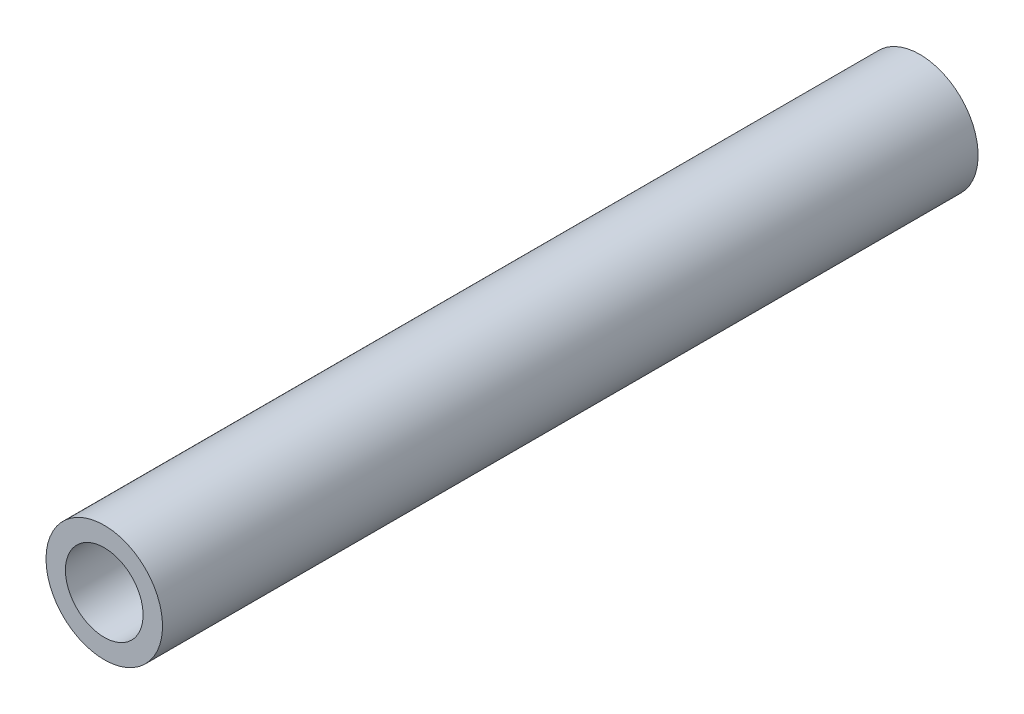
ISO-10303-21;
HEADER;
FILE_DESCRIPTION(('STEP AP214'),'2;1');
FILE_NAME('part.step','',(''),(''),'','','');
FILE_SCHEMA(('AUTOMOTIVE_DESIGN { 1 0 10303 214 1 1 1 1 }'));
ENDSEC;
DATA;
#1=APPLICATION_CONTEXT('core data for automotive mechanical design processes');
#2=APPLICATION_PROTOCOL_DEFINITION('international standard','automotive_design',2000,#1);
#3=PRODUCT_CONTEXT('',#1,'mechanical');
#4=PRODUCT('Part','Part','',(#3));
#5=PRODUCT_RELATED_PRODUCT_CATEGORY('part','',(#4));
#6=PRODUCT_DEFINITION_FORMATION('','',#4);
#7=PRODUCT_DEFINITION_CONTEXT('part definition',#1,'design');
#8=PRODUCT_DEFINITION('design','',#6,#7);
#9=PRODUCT_DEFINITION_SHAPE('','',#8);
#10=(LENGTH_UNIT() NAMED_UNIT(*) SI_UNIT(.MILLI.,.METRE.));
#11=(NAMED_UNIT(*) PLANE_ANGLE_UNIT() SI_UNIT($,.RADIAN.));
#12=(NAMED_UNIT(*) SI_UNIT($,.STERADIAN.) SOLID_ANGLE_UNIT());
#13=UNCERTAINTY_MEASURE_WITH_UNIT(LENGTH_MEASURE(1.E-05),#10,'distance_accuracy_value','');
#14=(GEOMETRIC_REPRESENTATION_CONTEXT(3) GLOBAL_UNCERTAINTY_ASSIGNED_CONTEXT((#13)) GLOBAL_UNIT_ASSIGNED_CONTEXT((#10,
#11,#12)) REPRESENTATION_CONTEXT('',''));
#15=CARTESIAN_POINT('',(0.,0.,0.));
#16=DIRECTION('',(0.,0.,1.));
#17=DIRECTION('',(1.,0.,0.));
#18=AXIS2_PLACEMENT_3D('',#15,#16,#17);
#19=CARTESIAN_POINT('',(13.,-54.5,0.));
#20=DIRECTION('',(0.,0.,1.));
#21=DIRECTION('',(1.,0.,0.));
#22=AXIS2_PLACEMENT_3D('',#19,#20,#21);
#23=PLANE('',#22);
#24=CARTESIAN_POINT('',(13.,-54.5,0.));
#25=DIRECTION('',(0.,0.,1.));
#26=DIRECTION('',(1.,0.,0.));
#27=AXIS2_PLACEMENT_3D('',#24,#25,#26);
#28=CIRCLE('',#27,3.);
#29=CARTESIAN_POINT('',(9.99999999999998,-54.5,0.));
#30=VERTEX_POINT('',#29);
#31=EDGE_CURVE('E38',#30,#30,#28,.T.);
#32=ORIENTED_EDGE('',*,*,#31,.F.);
#33=EDGE_LOOP('',(#32));
#34=FACE_BOUND('',#33,.T.);
#35=CARTESIAN_POINT('',(13.,-54.5,0.));
#36=DIRECTION('',(0.,0.,1.));
#37=DIRECTION('',(1.,0.,0.));
#38=AXIS2_PLACEMENT_3D('',#35,#36,#37);
#39=CIRCLE('',#38,2.);
#40=CARTESIAN_POINT('',(11.,-54.5,0.));
#41=VERTEX_POINT('',#40);
#42=EDGE_CURVE('E47',#41,#41,#39,.T.);
#43=ORIENTED_EDGE('',*,*,#42,.T.);
#44=EDGE_LOOP('',(#43));
#45=FACE_BOUND('',#44,.T.);
#46=ADVANCED_FACE('F31',(#34,#45),#23,.F.);
#47=CARTESIAN_POINT('',(13.,-54.5,50.4852813742386));
#48=DIRECTION('',(0.,0.,-1.));
#49=DIRECTION('',(-1.,0.,0.));
#50=AXIS2_PLACEMENT_3D('',#47,#48,#49);
#51=CYLINDRICAL_SURFACE('',#50,3.);
#52=CARTESIAN_POINT('',(13.,-54.5,42.));
#53=DIRECTION('',(0.,0.,-1.));
#54=DIRECTION('',(-1.,0.,0.));
#55=AXIS2_PLACEMENT_3D('',#52,#53,#54);
#56=CIRCLE('',#55,3.);
#57=CARTESIAN_POINT('',(9.99999999999998,-54.5,42.));
#58=VERTEX_POINT('',#57);
#59=EDGE_CURVE('E42',#58,#58,#56,.T.);
#60=CARTESIAN_POINT('',(9.99999999999998,-54.5,42.));
#61=CARTESIAN_POINT('',(9.99999999999998,-54.5,41.5625));
#62=CARTESIAN_POINT('',(9.99999999999998,-54.5,41.125));
#63=CARTESIAN_POINT('',(9.99999999999998,-54.5,40.25));
#64=CARTESIAN_POINT('',(9.99999999999998,-54.5,39.8125));
#65=CARTESIAN_POINT('',(9.99999999999998,-54.5,38.9375));
#66=CARTESIAN_POINT('',(9.99999999999998,-54.5,38.5));
#67=CARTESIAN_POINT('',(9.99999999999998,-54.5,37.625));
#68=CARTESIAN_POINT('',(9.99999999999998,-54.5,37.1875));
#69=CARTESIAN_POINT('',(9.99999999999998,-54.5,36.3125));
#70=CARTESIAN_POINT('',(9.99999999999998,-54.5,35.875));
#71=CARTESIAN_POINT('',(9.99999999999998,-54.5,35.));
#72=CARTESIAN_POINT('',(9.99999999999998,-54.5,34.5625));
#73=CARTESIAN_POINT('',(9.99999999999998,-54.5,33.6875));
#74=CARTESIAN_POINT('',(9.99999999999998,-54.5,33.25));
#75=CARTESIAN_POINT('',(9.99999999999998,-54.5,32.375));
#76=CARTESIAN_POINT('',(9.99999999999998,-54.5,31.9375));
#77=CARTESIAN_POINT('',(9.99999999999998,-54.5,31.0625));
#78=CARTESIAN_POINT('',(9.99999999999998,-54.5,30.625));
#79=CARTESIAN_POINT('',(9.99999999999998,-54.5,29.75));
#80=CARTESIAN_POINT('',(9.99999999999998,-54.5,29.3125));
#81=CARTESIAN_POINT('',(9.99999999999998,-54.5,28.4375));
#82=CARTESIAN_POINT('',(9.99999999999998,-54.5,28.));
#83=CARTESIAN_POINT('',(9.99999999999998,-54.5,27.125));
#84=CARTESIAN_POINT('',(9.99999999999998,-54.5,26.6875));
#85=CARTESIAN_POINT('',(9.99999999999998,-54.5,25.8125));
#86=CARTESIAN_POINT('',(9.99999999999998,-54.5,25.375));
#87=CARTESIAN_POINT('',(9.99999999999998,-54.5,24.5));
#88=CARTESIAN_POINT('',(9.99999999999998,-54.5,24.0625));
#89=CARTESIAN_POINT('',(9.99999999999998,-54.5,23.1875));
#90=CARTESIAN_POINT('',(9.99999999999998,-54.5,22.75));
#91=CARTESIAN_POINT('',(9.99999999999998,-54.5,21.875));
#92=CARTESIAN_POINT('',(9.99999999999998,-54.5,21.4375));
#93=CARTESIAN_POINT('',(9.99999999999998,-54.5,20.5625));
#94=CARTESIAN_POINT('',(9.99999999999998,-54.5,20.125));
#95=CARTESIAN_POINT('',(9.99999999999998,-54.5,19.25));
#96=CARTESIAN_POINT('',(9.99999999999998,-54.5,18.8125));
#97=CARTESIAN_POINT('',(9.99999999999998,-54.5,17.9375));
#98=CARTESIAN_POINT('',(9.99999999999998,-54.5,17.5));
#99=CARTESIAN_POINT('',(9.99999999999998,-54.5,16.625));
#100=CARTESIAN_POINT('',(9.99999999999998,-54.5,16.1875));
#101=CARTESIAN_POINT('',(9.99999999999998,-54.5,15.3125));
#102=CARTESIAN_POINT('',(9.99999999999998,-54.5,14.875));
#103=CARTESIAN_POINT('',(9.99999999999998,-54.5,14.));
#104=CARTESIAN_POINT('',(9.99999999999998,-54.5,13.5625));
#105=CARTESIAN_POINT('',(9.99999999999998,-54.5,12.6875));
#106=CARTESIAN_POINT('',(9.99999999999998,-54.5,12.25));
#107=CARTESIAN_POINT('',(9.99999999999998,-54.5,11.375));
#108=CARTESIAN_POINT('',(9.99999999999998,-54.5,10.9375));
#109=CARTESIAN_POINT('',(9.99999999999998,-54.5,10.0625));
#110=CARTESIAN_POINT('',(9.99999999999998,-54.5,9.625));
#111=CARTESIAN_POINT('',(9.99999999999998,-54.5,8.75));
#112=CARTESIAN_POINT('',(9.99999999999998,-54.5,8.3125));
#113=CARTESIAN_POINT('',(9.99999999999998,-54.5,7.4375));
#114=CARTESIAN_POINT('',(9.99999999999998,-54.5,7.));
#115=CARTESIAN_POINT('',(9.99999999999998,-54.5,6.125));
#116=CARTESIAN_POINT('',(9.99999999999998,-54.5,5.6875));
#117=CARTESIAN_POINT('',(9.99999999999998,-54.5,4.8125));
#118=CARTESIAN_POINT('',(9.99999999999998,-54.5,4.375));
#119=CARTESIAN_POINT('',(9.99999999999998,-54.5,3.5));
#120=CARTESIAN_POINT('',(9.99999999999998,-54.5,3.0625));
#121=CARTESIAN_POINT('',(9.99999999999998,-54.5,2.1875));
#122=CARTESIAN_POINT('',(9.99999999999998,-54.5,1.75));
#123=CARTESIAN_POINT('',(9.99999999999998,-54.5,0.875000000000001));
#124=CARTESIAN_POINT('',(9.99999999999998,-54.5,0.4375));
#125=CARTESIAN_POINT('',(9.99999999999998,-54.5,0.));
#126=B_SPLINE_CURVE_WITH_KNOTS('',3,(#60,#61,#62,#63,#64,#65,#66,#67,#68,#69,#70,#71,#72,#73,
#74,#75,#76,#77,#78,#79,#80,#81,#82,#83,#84,#85,#86,#87,#88,#89,#90,#91,#92,#93,#94,#95,#96,#97,
#98,#99,#100,#101,#102,#103,#104,#105,#106,#107,#108,#109,#110,#111,#112,#113,#114,#115,#116,
#117,#118,#119,#120,#121,#122,#123,#124,#125),.UNSPECIFIED.,.F.,.F.,(4,2,2,2,2,2,2,2,2,2,2,2,2,
2,2,2,2,2,2,2,2,2,2,2,2,2,2,2,2,2,2,2,4),(0.,1.3125,2.625,3.9375,5.25,6.5625,7.875,
9.18749999999999,10.5,11.8125,13.125,14.4375,15.75,17.0625,18.375,19.6875,21.,22.3125,23.625,
24.9375,26.25,27.5625,28.875,30.1875,31.5,32.8125,34.125,35.4375,36.75,38.0625,39.375,40.6875,
42.),.UNSPECIFIED.);
#127=EDGE_CURVE('BSEAM55',#58,#30,#126,.T.);
#128=ORIENTED_EDGE('',*,*,#59,.T.);
#129=ORIENTED_EDGE('',*,*,#31,.T.);
#130=ORIENTED_EDGE('',*,*,#127,.T.);
#131=ORIENTED_EDGE('',*,*,#127,.F.);
#132=EDGE_LOOP('',(#128,#130,#129,#131));
#133=FACE_BOUND('',#132,.T.);
#134=ADVANCED_FACE('F55',(#133),#51,.T.);
#135=CARTESIAN_POINT('',(13.,-54.5,50.4852813742386));
#136=DIRECTION('',(0.,0.,-1.));
#137=DIRECTION('',(-1.,0.,0.));
#138=AXIS2_PLACEMENT_3D('',#135,#136,#137);
#139=CYLINDRICAL_SURFACE('',#138,2.);
#140=CARTESIAN_POINT('',(13.,-54.5,42.));
#141=DIRECTION('',(0.,0.,-1.));
#142=DIRECTION('',(-1.,0.,0.));
#143=AXIS2_PLACEMENT_3D('',#140,#141,#142);
#144=CIRCLE('',#143,2.);
#145=CARTESIAN_POINT('',(11.,-54.5,42.));
#146=VERTEX_POINT('',#145);
#147=EDGE_CURVE('E10',#146,#146,#144,.T.);
#148=CARTESIAN_POINT('',(11.,-54.5,42.));
#149=CARTESIAN_POINT('',(11.,-54.5,41.5625));
#150=CARTESIAN_POINT('',(11.,-54.5,41.125));
#151=CARTESIAN_POINT('',(11.,-54.5,40.25));
#152=CARTESIAN_POINT('',(11.,-54.5,39.8125));
#153=CARTESIAN_POINT('',(11.,-54.5,38.9375));
#154=CARTESIAN_POINT('',(11.,-54.5,38.5));
#155=CARTESIAN_POINT('',(11.,-54.5,37.625));
#156=CARTESIAN_POINT('',(11.,-54.5,37.1875));
#157=CARTESIAN_POINT('',(11.,-54.5,36.3125));
#158=CARTESIAN_POINT('',(11.,-54.5,35.875));
#159=CARTESIAN_POINT('',(11.,-54.5,35.));
#160=CARTESIAN_POINT('',(11.,-54.5,34.5625));
#161=CARTESIAN_POINT('',(11.,-54.5,33.6875));
#162=CARTESIAN_POINT('',(11.,-54.5,33.25));
#163=CARTESIAN_POINT('',(11.,-54.5,32.375));
#164=CARTESIAN_POINT('',(11.,-54.5,31.9375));
#165=CARTESIAN_POINT('',(11.,-54.5,31.0625));
#166=CARTESIAN_POINT('',(11.,-54.5,30.625));
#167=CARTESIAN_POINT('',(11.,-54.5,29.75));
#168=CARTESIAN_POINT('',(11.,-54.5,29.3125));
#169=CARTESIAN_POINT('',(11.,-54.5,28.4375));
#170=CARTESIAN_POINT('',(11.,-54.5,28.));
#171=CARTESIAN_POINT('',(11.,-54.5,27.125));
#172=CARTESIAN_POINT('',(11.,-54.5,26.6875));
#173=CARTESIAN_POINT('',(11.,-54.5,25.8125));
#174=CARTESIAN_POINT('',(11.,-54.5,25.375));
#175=CARTESIAN_POINT('',(11.,-54.5,24.5));
#176=CARTESIAN_POINT('',(11.,-54.5,24.0625));
#177=CARTESIAN_POINT('',(11.,-54.5,23.1875));
#178=CARTESIAN_POINT('',(11.,-54.5,22.75));
#179=CARTESIAN_POINT('',(11.,-54.5,21.875));
#180=CARTESIAN_POINT('',(11.,-54.5,21.4375));
#181=CARTESIAN_POINT('',(11.,-54.5,20.5625));
#182=CARTESIAN_POINT('',(11.,-54.5,20.125));
#183=CARTESIAN_POINT('',(11.,-54.5,19.25));
#184=CARTESIAN_POINT('',(11.,-54.5,18.8125));
#185=CARTESIAN_POINT('',(11.,-54.5,17.9375));
#186=CARTESIAN_POINT('',(11.,-54.5,17.5));
#187=CARTESIAN_POINT('',(11.,-54.5,16.625));
#188=CARTESIAN_POINT('',(11.,-54.5,16.1875));
#189=CARTESIAN_POINT('',(11.,-54.5,15.3125));
#190=CARTESIAN_POINT('',(11.,-54.5,14.875));
#191=CARTESIAN_POINT('',(11.,-54.5,14.));
#192=CARTESIAN_POINT('',(11.,-54.5,13.5625));
#193=CARTESIAN_POINT('',(11.,-54.5,12.6875));
#194=CARTESIAN_POINT('',(11.,-54.5,12.25));
#195=CARTESIAN_POINT('',(11.,-54.5,11.375));
#196=CARTESIAN_POINT('',(11.,-54.5,10.9375));
#197=CARTESIAN_POINT('',(11.,-54.5,10.0625));
#198=CARTESIAN_POINT('',(11.,-54.5,9.625));
#199=CARTESIAN_POINT('',(11.,-54.5,8.75));
#200=CARTESIAN_POINT('',(11.,-54.5,8.3125));
#201=CARTESIAN_POINT('',(11.,-54.5,7.4375));
#202=CARTESIAN_POINT('',(11.,-54.5,7.));
#203=CARTESIAN_POINT('',(11.,-54.5,6.125));
#204=CARTESIAN_POINT('',(11.,-54.5,5.6875));
#205=CARTESIAN_POINT('',(11.,-54.5,4.8125));
#206=CARTESIAN_POINT('',(11.,-54.5,4.375));
#207=CARTESIAN_POINT('',(11.,-54.5,3.5));
#208=CARTESIAN_POINT('',(11.,-54.5,3.0625));
#209=CARTESIAN_POINT('',(11.,-54.5,2.1875));
#210=CARTESIAN_POINT('',(11.,-54.5,1.75));
#211=CARTESIAN_POINT('',(11.,-54.5,0.875000000000001));
#212=CARTESIAN_POINT('',(11.,-54.5,0.4375));
#213=CARTESIAN_POINT('',(11.,-54.5,0.));
#214=B_SPLINE_CURVE_WITH_KNOTS('',3,(#148,#149,#150,#151,#152,#153,#154,#155,#156,#157,#158,
#159,#160,#161,#162,#163,#164,#165,#166,#167,#168,#169,#170,#171,#172,#173,#174,#175,#176,#177,
#178,#179,#180,#181,#182,#183,#184,#185,#186,#187,#188,#189,#190,#191,#192,#193,#194,#195,#196,
#197,#198,#199,#200,#201,#202,#203,#204,#205,#206,#207,#208,#209,#210,#211,#212,#213),
.UNSPECIFIED.,.F.,.F.,(4,2,2,2,2,2,2,2,2,2,2,2,2,2,2,2,2,2,2,2,2,2,2,2,2,2,2,2,2,2,2,2,4),(0.,
1.3125,2.625,3.9375,5.25,6.5625,7.875,9.18749999999999,10.5,11.8125,13.125,14.4375,15.75,
17.0625,18.375,19.6875,21.,22.3125,23.625,24.9375,26.25,27.5625,28.875,30.1875,31.5,32.8125,
34.125,35.4375,36.75,38.0625,39.375,40.6875,42.),.UNSPECIFIED.);
#215=EDGE_CURVE('BSEAM53',#146,#41,#214,.T.);
#216=ORIENTED_EDGE('',*,*,#147,.F.);
#217=ORIENTED_EDGE('',*,*,#42,.F.);
#218=ORIENTED_EDGE('',*,*,#215,.T.);
#219=ORIENTED_EDGE('',*,*,#215,.F.);
#220=EDGE_LOOP('',(#216,#218,#217,#219));
#221=FACE_BOUND('',#220,.T.);
#222=ADVANCED_FACE('F53',(#221),#139,.F.);
#223=CARTESIAN_POINT('',(35.5,0.,42.));
#224=DIRECTION('',(0.,0.,-1.));
#225=DIRECTION('',(1.,0.,0.));
#226=AXIS2_PLACEMENT_3D('',#223,#224,#225);
#227=PLANE('',#226);
#228=ORIENTED_EDGE('',*,*,#147,.T.);
#229=EDGE_LOOP('',(#228));
#230=FACE_BOUND('',#229,.T.);
#231=ORIENTED_EDGE('',*,*,#59,.F.);
#232=EDGE_LOOP('',(#231));
#233=FACE_BOUND('',#232,.T.);
#234=ADVANCED_FACE('F33',(#230,#233),#227,.F.);
#235=CLOSED_SHELL('',(#46,#134,#222,#234));
#236=MANIFOLD_SOLID_BREP('B2',#235);
#237=ADVANCED_BREP_SHAPE_REPRESENTATION('',(#18,#236),#14);
#238=SHAPE_DEFINITION_REPRESENTATION(#9,#237);
ENDSEC;
END-ISO-10303-21;
